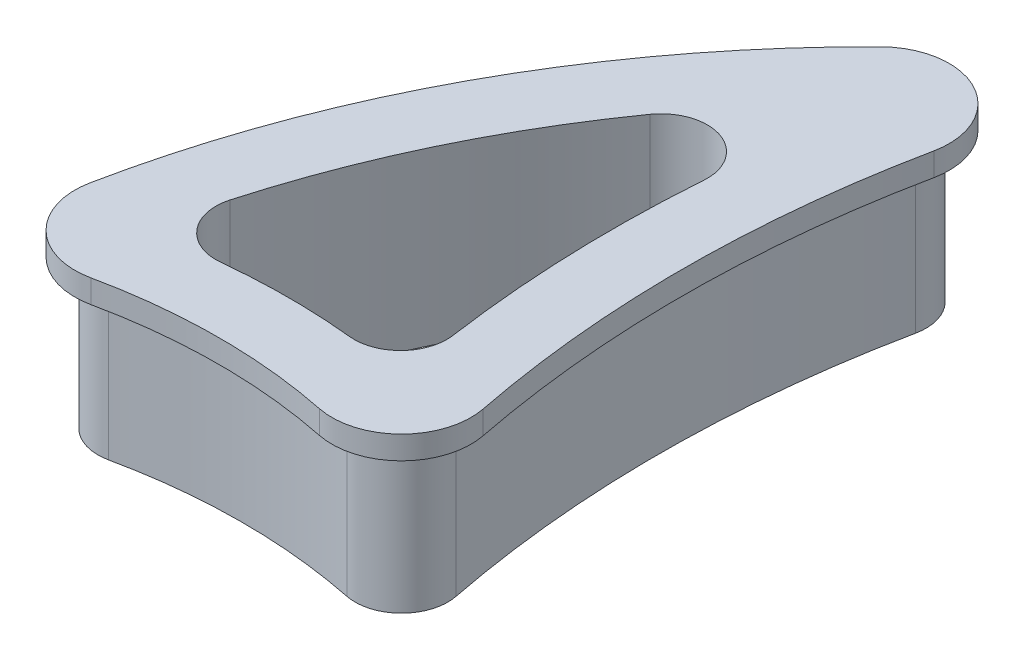
ISO-10303-21;
HEADER;
FILE_DESCRIPTION(('STEP AP214'),'2;1');
FILE_NAME('part.step','',(''),(''),'','','');
FILE_SCHEMA(('AUTOMOTIVE_DESIGN { 1 0 10303 214 1 1 1 1 }'));
ENDSEC;
DATA;
#1=APPLICATION_CONTEXT('core data for automotive mechanical design processes');
#2=APPLICATION_PROTOCOL_DEFINITION('international standard','automotive_design',2000,#1);
#3=PRODUCT_CONTEXT('',#1,'mechanical');
#4=PRODUCT('Part','Part','',(#3));
#5=PRODUCT_RELATED_PRODUCT_CATEGORY('part','',(#4));
#6=PRODUCT_DEFINITION_FORMATION('','',#4);
#7=PRODUCT_DEFINITION_CONTEXT('part definition',#1,'design');
#8=PRODUCT_DEFINITION('design','',#6,#7);
#9=PRODUCT_DEFINITION_SHAPE('','',#8);
#10=(LENGTH_UNIT() NAMED_UNIT(*) SI_UNIT(.MILLI.,.METRE.));
#11=(NAMED_UNIT(*) PLANE_ANGLE_UNIT() SI_UNIT($,.RADIAN.));
#12=(NAMED_UNIT(*) SI_UNIT($,.STERADIAN.) SOLID_ANGLE_UNIT());
#13=UNCERTAINTY_MEASURE_WITH_UNIT(LENGTH_MEASURE(1.E-05),#10,'distance_accuracy_value','');
#14=(GEOMETRIC_REPRESENTATION_CONTEXT(3) GLOBAL_UNCERTAINTY_ASSIGNED_CONTEXT((#13)) GLOBAL_UNIT_ASSIGNED_CONTEXT((#10,
#11,#12)) REPRESENTATION_CONTEXT('',''));
#15=CARTESIAN_POINT('',(0.,0.,0.));
#16=DIRECTION('',(0.,0.,1.));
#17=DIRECTION('',(1.,0.,0.));
#18=AXIS2_PLACEMENT_3D('',#15,#16,#17);
#19=CARTESIAN_POINT('',(-7.36020796228612,0.,29.1675967172615));
#20=DIRECTION('',(0.,1.,0.));
#21=DIRECTION('',(0.,0.,1.));
#22=AXIS2_PLACEMENT_3D('',#19,#20,#21);
#23=PLANE('',#22);
#24=CARTESIAN_POINT('',(-10.1796640957932,0.,15.9652989206191));
#25=DIRECTION('',(0.,1.,0.));
#26=DIRECTION('',(0.,0.,1.));
#27=AXIS2_PLACEMENT_3D('',#24,#25,#26);
#28=CIRCLE('',#27,2.);
#29=CARTESIAN_POINT('',(-12.1404156393956,0.,15.5710231487782));
#30=VERTEX_POINT('',#29);
#31=CARTESIAN_POINT('',(-9.76196689082921,0.,17.921194890492));
#32=VERTEX_POINT('',#31);
#33=EDGE_CURVE('E150',#30,#32,#28,.T.);
#34=ORIENTED_EDGE('',*,*,#33,.F.);
#35=CARTESIAN_POINT('',(29.0353667762552,0.,23.8508143574366));
#36=DIRECTION('',(0.,1.,0.));
#37=DIRECTION('',(0.,0.,1.));
#38=AXIS2_PLACEMENT_3D('',#35,#36,#37);
#39=CIRCLE('',#38,42.);
#40=CARTESIAN_POINT('',(-0.452755983980344,0.,-6.05655289675813));
#41=VERTEX_POINT('',#40);
#42=EDGE_CURVE('E94',#41,#30,#39,.T.);
#43=ORIENTED_EDGE('',*,*,#42,.F.);
#44=CARTESIAN_POINT('',(0.951440337935632,0.,-4.63239255132028));
#45=DIRECTION('',(0.,1.,0.));
#46=DIRECTION('',(0.,0.,-1.));
#47=AXIS2_PLACEMENT_3D('',#44,#45,#46);
#48=CIRCLE('',#47,2.);
#49=CARTESIAN_POINT('',(2.91037615764035,0.,-4.22919228559886));
#50=VERTEX_POINT('',#49);
#51=EDGE_CURVE('E163',#50,#41,#48,.T.);
#52=ORIENTED_EDGE('',*,*,#51,.F.);
#53=CARTESIAN_POINT('',(51.8837716502582,0.,5.85081435743656));
#54=DIRECTION('',(0.,-1.,0.));
#55=DIRECTION('',(0.,0.,-1.));
#56=AXIS2_PLACEMENT_3D('',#53,#54,#55);
#57=CIRCLE('',#56,50.);
#58=CARTESIAN_POINT('',(2.82956510408878,0.,15.5299062634858));
#59=VERTEX_POINT('',#58);
#60=EDGE_CURVE('E160',#59,#50,#57,.T.);
#61=ORIENTED_EDGE('',*,*,#60,.F.);
#62=CARTESIAN_POINT('',(0.867396842242008,0.,15.9170699397278));
#63=DIRECTION('',(0.,1.,0.));
#64=DIRECTION('',(0.,0.,1.));
#65=AXIS2_PLACEMENT_3D('',#62,#63,#64);
#66=CIRCLE('',#65,2.);
#67=CARTESIAN_POINT('',(0.46679323698119,0.,17.8765384267038));
#68=VERTEX_POINT('',#67);
#69=EDGE_CURVE('E118',#68,#59,#66,.T.);
#70=ORIENTED_EDGE('',*,*,#69,.F.);
#71=CARTESIAN_POINT('',(-4.54075182877902,0.,42.3698945139039));
#72=DIRECTION('',(0.,-1.,0.));
#73=DIRECTION('',(0.,0.,-1.));
#74=AXIS2_PLACEMENT_3D('',#71,#72,#73);
#75=CIRCLE('',#74,25.);
#76=EDGE_CURVE('E154',#32,#68,#75,.T.);
#77=ORIENTED_EDGE('',*,*,#76,.F.);
#78=EDGE_LOOP('',(#34,#43,#52,#61,#70,#77));
#79=FACE_BOUND('',#78,.T.);
#80=CARTESIAN_POINT('',(-7.5347674700161,0.,13.5248625267483));
#81=DIRECTION('',(0.,1.,0.));
#82=DIRECTION('',(0.,0.,1.));
#83=AXIS2_PLACEMENT_3D('',#80,#81,#82);
#84=CIRCLE('',#83,2.);
#85=CARTESIAN_POINT('',(-9.45951137771458,0.,12.9813913777647));
#86=VERTEX_POINT('',#85);
#87=CARTESIAN_POINT('',(-7.3282836326894,0.,15.5141750775866));
#88=VERTEX_POINT('',#87);
#89=EDGE_CURVE('E58',#86,#88,#84,.T.);
#90=ORIENTED_EDGE('',*,*,#89,.T.);
#91=CARTESIAN_POINT('',(-4.54075182877902,0.,42.3698945139039));
#92=DIRECTION('',(0.,-1.,0.));
#93=DIRECTION('',(0.,0.,-1.));
#94=AXIS2_PLACEMENT_3D('',#91,#92,#93);
#95=CIRCLE('',#94,27.);
#96=CARTESIAN_POINT('',(-1.77346678919542,0.,15.5120812464449));
#97=VERTEX_POINT('',#96);
#98=EDGE_CURVE('E225',#88,#97,#95,.T.);
#99=ORIENTED_EDGE('',*,*,#98,.T.);
#100=CARTESIAN_POINT('',(-1.56848271218923,0.,13.5226135970035));
#101=DIRECTION('',(0.,1.,0.));
#102=DIRECTION('',(0.,0.,1.));
#103=AXIS2_PLACEMENT_3D('',#100,#101,#102);
#104=CIRCLE('',#103,2.);
#105=CARTESIAN_POINT('',(0.411230412345864,0.,13.2384728844269));
#106=VERTEX_POINT('',#105);
#107=EDGE_CURVE('E221',#97,#106,#104,.T.);
#108=ORIENTED_EDGE('',*,*,#107,.T.);
#109=CARTESIAN_POINT('',(51.8837716502582,0.,5.85081435743656));
#110=DIRECTION('',(0.,-1.,0.));
#111=DIRECTION('',(0.,0.,-1.));
#112=AXIS2_PLACEMENT_3D('',#109,#110,#111);
#113=CIRCLE('',#112,52.);
#114=CARTESIAN_POINT('',(0.024455921151423,0.,2.02833190373986));
#115=VERTEX_POINT('',#114);
#116=EDGE_CURVE('E217',#106,#115,#113,.T.);
#117=ORIENTED_EDGE('',*,*,#116,.T.);
#118=CARTESIAN_POINT('',(-1.97013314535268,0.,1.88131334782845));
#119=DIRECTION('',(0.,1.,0.));
#120=DIRECTION('',(0.,0.,1.));
#121=AXIS2_PLACEMENT_3D('',#118,#119,#120);
#122=CIRCLE('',#121,2.);
#123=CARTESIAN_POINT('',(-3.60200156227942,0.,0.725023821006962));
#124=VERTEX_POINT('',#123);
#125=EDGE_CURVE('E213',#115,#124,#122,.T.);
#126=ORIENTED_EDGE('',*,*,#125,.T.);
#127=CARTESIAN_POINT('',(29.0353667762552,0.,23.8508143574366));
#128=DIRECTION('',(0.,1.,0.));
#129=DIRECTION('',(0.,0.,1.));
#130=AXIS2_PLACEMENT_3D('',#127,#128,#129);
#131=CIRCLE('',#130,40.);
#132=EDGE_CURVE('E209',#124,#86,#131,.T.);
#133=ORIENTED_EDGE('',*,*,#132,.T.);
#134=EDGE_LOOP('',(#90,#99,#108,#117,#126,#133));
#135=FACE_BOUND('',#134,.T.);
#136=ADVANCED_FACE('F42',(#79,#135),#23,.F.);
#137=CARTESIAN_POINT('',(-10.1796640957932,6.4,15.9652989206191));
#138=DIRECTION('',(0.,-1.,0.));
#139=DIRECTION('',(0.,0.,-1.));
#140=AXIS2_PLACEMENT_3D('',#137,#138,#139);
#141=CYLINDRICAL_SURFACE('',#140,2.);
#142=ORIENTED_EDGE('',*,*,#33,.T.);
#143=DIRECTION('',(0.,-1.,0.));
#144=VECTOR('',#143,1.);
#145=CARTESIAN_POINT('',(-9.76196689082921,6.4,17.921194890492));
#146=LINE('',#145,#144);
#147=CARTESIAN_POINT('',(-9.76196689082921,6.4,17.921194890492));
#148=VERTEX_POINT('',#147);
#149=EDGE_CURVE('E11',#148,#32,#146,.T.);
#150=ORIENTED_EDGE('',*,*,#149,.F.);
#151=CARTESIAN_POINT('',(-10.1796640957932,6.4,15.9652989206191));
#152=DIRECTION('',(0.,1.,0.));
#153=DIRECTION('',(0.,0.,1.));
#154=AXIS2_PLACEMENT_3D('',#151,#152,#153);
#155=CIRCLE('',#154,2.);
#156=CARTESIAN_POINT('',(-12.1404156393956,6.4,15.5710231487782));
#157=VERTEX_POINT('',#156);
#158=EDGE_CURVE('E140',#157,#148,#155,.T.);
#159=ORIENTED_EDGE('',*,*,#158,.F.);
#160=DIRECTION('',(0.,-1.,0.));
#161=VECTOR('',#160,1.);
#162=CARTESIAN_POINT('',(-12.1404156393956,6.4,15.5710231487782));
#163=LINE('',#162,#161);
#164=EDGE_CURVE('E149',#157,#30,#163,.T.);
#165=ORIENTED_EDGE('',*,*,#164,.T.);
#166=EDGE_LOOP('',(#142,#150,#159,#165));
#167=FACE_BOUND('',#166,.T.);
#168=ADVANCED_FACE('F44',(#167),#141,.T.);
#169=CARTESIAN_POINT('',(-4.54075182877902,6.4,42.3698945139039));
#170=DIRECTION('',(0.,-1.,0.));
#171=DIRECTION('',(0.,0.,-1.));
#172=AXIS2_PLACEMENT_3D('',#169,#170,#171);
#173=CYLINDRICAL_SURFACE('',#172,25.);
#174=ORIENTED_EDGE('',*,*,#76,.T.);
#175=DIRECTION('',(0.,-1.,0.));
#176=VECTOR('',#175,1.);
#177=CARTESIAN_POINT('',(0.46679323698119,6.4,17.8765384267038));
#178=LINE('',#177,#176);
#179=CARTESIAN_POINT('',(0.46679323698119,6.4,17.8765384267038));
#180=VERTEX_POINT('',#179);
#181=EDGE_CURVE('E51',#180,#68,#178,.T.);
#182=ORIENTED_EDGE('',*,*,#181,.F.);
#183=CARTESIAN_POINT('',(-4.54075182877902,6.4,42.3698945139039));
#184=DIRECTION('',(0.,-1.,0.));
#185=DIRECTION('',(0.,0.,-1.));
#186=AXIS2_PLACEMENT_3D('',#183,#184,#185);
#187=CIRCLE('',#186,25.);
#188=EDGE_CURVE('E102',#148,#180,#187,.T.);
#189=ORIENTED_EDGE('',*,*,#188,.F.);
#190=ORIENTED_EDGE('',*,*,#149,.T.);
#191=EDGE_LOOP('',(#174,#182,#189,#190));
#192=FACE_BOUND('',#191,.T.);
#193=ADVANCED_FACE('F411',(#192),#173,.F.);
#194=CARTESIAN_POINT('',(0.867396842242008,6.4,15.9170699397278));
#195=DIRECTION('',(0.,-1.,0.));
#196=DIRECTION('',(0.,0.,-1.));
#197=AXIS2_PLACEMENT_3D('',#194,#195,#196);
#198=CYLINDRICAL_SURFACE('',#197,2.);
#199=ORIENTED_EDGE('',*,*,#69,.T.);
#200=DIRECTION('',(0.,-1.,0.));
#201=VECTOR('',#200,1.);
#202=CARTESIAN_POINT('',(2.82956510408878,6.4,15.5299062634858));
#203=LINE('',#202,#201);
#204=CARTESIAN_POINT('',(2.82956510408878,6.4,15.5299062634858));
#205=VERTEX_POINT('',#204);
#206=EDGE_CURVE('E111',#205,#59,#203,.T.);
#207=ORIENTED_EDGE('',*,*,#206,.F.);
#208=CARTESIAN_POINT('',(0.867396842242008,6.4,15.9170699397278));
#209=DIRECTION('',(0.,1.,0.));
#210=DIRECTION('',(0.,0.,1.));
#211=AXIS2_PLACEMENT_3D('',#208,#209,#210);
#212=CIRCLE('',#211,2.);
#213=EDGE_CURVE('E116',#180,#205,#212,.T.);
#214=ORIENTED_EDGE('',*,*,#213,.F.);
#215=ORIENTED_EDGE('',*,*,#181,.T.);
#216=EDGE_LOOP('',(#199,#207,#214,#215));
#217=FACE_BOUND('',#216,.T.);
#218=ADVANCED_FACE('F113',(#217),#198,.T.);
#219=CARTESIAN_POINT('',(51.8837716502582,6.4,5.85081435743656));
#220=DIRECTION('',(0.,-1.,0.));
#221=DIRECTION('',(0.,0.,-1.));
#222=AXIS2_PLACEMENT_3D('',#219,#220,#221);
#223=CYLINDRICAL_SURFACE('',#222,50.);
#224=ORIENTED_EDGE('',*,*,#60,.T.);
#225=DIRECTION('',(0.,-1.,0.));
#226=VECTOR('',#225,1.);
#227=CARTESIAN_POINT('',(2.91037615764035,6.4,-4.22919228559886));
#228=LINE('',#227,#226);
#229=CARTESIAN_POINT('',(2.91037615764035,6.4,-4.22919228559886));
#230=VERTEX_POINT('',#229);
#231=EDGE_CURVE('E122',#230,#50,#228,.T.);
#232=ORIENTED_EDGE('',*,*,#231,.F.);
#233=CARTESIAN_POINT('',(51.8837716502582,6.4,5.85081435743656));
#234=DIRECTION('',(0.,-1.,0.));
#235=DIRECTION('',(0.,0.,-1.));
#236=AXIS2_PLACEMENT_3D('',#233,#234,#235);
#237=CIRCLE('',#236,50.);
#238=EDGE_CURVE('E125',#205,#230,#237,.T.);
#239=ORIENTED_EDGE('',*,*,#238,.F.);
#240=ORIENTED_EDGE('',*,*,#206,.T.);
#241=EDGE_LOOP('',(#224,#232,#239,#240));
#242=FACE_BOUND('',#241,.T.);
#243=ADVANCED_FACE('F126',(#242),#223,.F.);
#244=CARTESIAN_POINT('',(0.951440337935632,6.4,-4.63239255132028));
#245=DIRECTION('',(0.,-1.,0.));
#246=DIRECTION('',(0.,0.,-1.));
#247=AXIS2_PLACEMENT_3D('',#244,#245,#246);
#248=CYLINDRICAL_SURFACE('',#247,2.);
#249=ORIENTED_EDGE('',*,*,#51,.T.);
#250=DIRECTION('',(0.,-1.,0.));
#251=VECTOR('',#250,1.);
#252=CARTESIAN_POINT('',(-0.452755983980344,6.4,-6.05655289675813));
#253=LINE('',#252,#251);
#254=CARTESIAN_POINT('',(-0.452755983980344,6.4,-6.05655289675813));
#255=VERTEX_POINT('',#254);
#256=EDGE_CURVE('E67',#255,#41,#253,.T.);
#257=ORIENTED_EDGE('',*,*,#256,.F.);
#258=CARTESIAN_POINT('',(0.951440337935632,6.4,-4.63239255132028));
#259=DIRECTION('',(0.,1.,0.));
#260=DIRECTION('',(0.,0.,-1.));
#261=AXIS2_PLACEMENT_3D('',#258,#259,#260);
#262=CIRCLE('',#261,2.);
#263=EDGE_CURVE('E131',#230,#255,#262,.T.);
#264=ORIENTED_EDGE('',*,*,#263,.F.);
#265=ORIENTED_EDGE('',*,*,#231,.T.);
#266=EDGE_LOOP('',(#249,#257,#264,#265));
#267=FACE_BOUND('',#266,.T.);
#268=ADVANCED_FACE('F178',(#267),#248,.T.);
#269=CARTESIAN_POINT('',(29.0353667762552,6.4,23.8508143574366));
#270=DIRECTION('',(0.,-1.,0.));
#271=DIRECTION('',(0.,0.,-1.));
#272=AXIS2_PLACEMENT_3D('',#269,#270,#271);
#273=CYLINDRICAL_SURFACE('',#272,42.);
#274=ORIENTED_EDGE('',*,*,#42,.T.);
#275=ORIENTED_EDGE('',*,*,#164,.F.);
#276=CARTESIAN_POINT('',(29.0353667762552,6.4,23.8508143574366));
#277=DIRECTION('',(0.,1.,0.));
#278=DIRECTION('',(0.,0.,1.));
#279=AXIS2_PLACEMENT_3D('',#276,#277,#278);
#280=CIRCLE('',#279,42.);
#281=EDGE_CURVE('E146',#255,#157,#280,.T.);
#282=ORIENTED_EDGE('',*,*,#281,.F.);
#283=ORIENTED_EDGE('',*,*,#256,.T.);
#284=EDGE_LOOP('',(#274,#275,#282,#283));
#285=FACE_BOUND('',#284,.T.);
#286=ADVANCED_FACE('F184',(#285),#273,.T.);
#287=CARTESIAN_POINT('',(-7.5347674700161,6.4,13.5248625267483));
#288=DIRECTION('',(0.,-1.,0.));
#289=DIRECTION('',(0.,0.,-1.));
#290=AXIS2_PLACEMENT_3D('',#287,#288,#289);
#291=CYLINDRICAL_SURFACE('',#290,2.);
#292=ORIENTED_EDGE('',*,*,#89,.F.);
#293=DIRECTION('',(0.,-1.,0.));
#294=VECTOR('',#293,1.);
#295=CARTESIAN_POINT('',(-9.45951137771458,6.4,12.9813913777647));
#296=LINE('',#295,#294);
#297=CARTESIAN_POINT('',(-9.45951137771459,7.4,12.9813913777647));
#298=VERTEX_POINT('',#297);
#299=EDGE_CURVE('E206',#298,#86,#296,.T.);
#300=ORIENTED_EDGE('',*,*,#299,.F.);
#301=CARTESIAN_POINT('',(-7.5347674700161,7.4,13.5248625267483));
#302=DIRECTION('',(0.,1.,0.));
#303=DIRECTION('',(0.,0.,1.));
#304=AXIS2_PLACEMENT_3D('',#301,#302,#303);
#305=CIRCLE('',#304,2.);
#306=CARTESIAN_POINT('',(-7.32828363268939,7.4,15.5141750775866));
#307=VERTEX_POINT('',#306);
#308=EDGE_CURVE('E315',#298,#307,#305,.T.);
#309=ORIENTED_EDGE('',*,*,#308,.T.);
#310=DIRECTION('',(0.,-1.,0.));
#311=VECTOR('',#310,1.);
#312=CARTESIAN_POINT('',(-7.3282836326894,6.4,15.5141750775866));
#313=LINE('',#312,#311);
#314=EDGE_CURVE('E155',#307,#88,#313,.T.);
#315=ORIENTED_EDGE('',*,*,#314,.T.);
#316=EDGE_LOOP('',(#292,#300,#309,#315));
#317=FACE_BOUND('',#316,.T.);
#318=ADVANCED_FACE('F397',(#317),#291,.F.);
#319=CARTESIAN_POINT('',(-4.54075182877902,6.4,42.3698945139039));
#320=DIRECTION('',(0.,-1.,0.));
#321=DIRECTION('',(0.,0.,-1.));
#322=AXIS2_PLACEMENT_3D('',#319,#320,#321);
#323=CYLINDRICAL_SURFACE('',#322,27.);
#324=ORIENTED_EDGE('',*,*,#98,.F.);
#325=ORIENTED_EDGE('',*,*,#314,.F.);
#326=CARTESIAN_POINT('',(-4.54075182877902,7.4,42.3698945139039));
#327=DIRECTION('',(0.,-1.,0.));
#328=DIRECTION('',(0.,0.,1.));
#329=AXIS2_PLACEMENT_3D('',#326,#327,#328);
#330=CIRCLE('',#329,27.);
#331=CARTESIAN_POINT('',(-1.77346678919542,7.4,15.5120812464449));
#332=VERTEX_POINT('',#331);
#333=EDGE_CURVE('E311',#307,#332,#330,.T.);
#334=ORIENTED_EDGE('',*,*,#333,.T.);
#335=DIRECTION('',(0.,-1.,0.));
#336=VECTOR('',#335,1.);
#337=CARTESIAN_POINT('',(-1.77346678919542,6.4,15.5120812464449));
#338=LINE('',#337,#336);
#339=EDGE_CURVE('E190',#332,#97,#338,.T.);
#340=ORIENTED_EDGE('',*,*,#339,.T.);
#341=EDGE_LOOP('',(#324,#325,#334,#340));
#342=FACE_BOUND('',#341,.T.);
#343=ADVANCED_FACE('F396',(#342),#323,.T.);
#344=CARTESIAN_POINT('',(-1.56848271218923,6.4,13.5226135970035));
#345=DIRECTION('',(0.,-1.,0.));
#346=DIRECTION('',(0.,0.,-1.));
#347=AXIS2_PLACEMENT_3D('',#344,#345,#346);
#348=CYLINDRICAL_SURFACE('',#347,2.);
#349=ORIENTED_EDGE('',*,*,#107,.F.);
#350=ORIENTED_EDGE('',*,*,#339,.F.);
#351=CARTESIAN_POINT('',(-1.56848271218923,7.4,13.5226135970035));
#352=DIRECTION('',(0.,1.,0.));
#353=DIRECTION('',(0.,0.,1.));
#354=AXIS2_PLACEMENT_3D('',#351,#352,#353);
#355=CIRCLE('',#354,1.99999999999999);
#356=CARTESIAN_POINT('',(0.411230412345857,7.4,13.2384728844269));
#357=VERTEX_POINT('',#356);
#358=EDGE_CURVE('E307',#332,#357,#355,.T.);
#359=ORIENTED_EDGE('',*,*,#358,.T.);
#360=DIRECTION('',(0.,-1.,0.));
#361=VECTOR('',#360,1.);
#362=CARTESIAN_POINT('',(0.411230412345864,6.4,13.2384728844269));
#363=LINE('',#362,#361);
#364=EDGE_CURVE('E194',#357,#106,#363,.T.);
#365=ORIENTED_EDGE('',*,*,#364,.T.);
#366=EDGE_LOOP('',(#349,#350,#359,#365));
#367=FACE_BOUND('',#366,.T.);
#368=ADVANCED_FACE('F393',(#367),#348,.F.);
#369=CARTESIAN_POINT('',(51.8837716502582,6.4,5.85081435743656));
#370=DIRECTION('',(0.,-1.,0.));
#371=DIRECTION('',(0.,0.,-1.));
#372=AXIS2_PLACEMENT_3D('',#369,#370,#371);
#373=CYLINDRICAL_SURFACE('',#372,52.);
#374=ORIENTED_EDGE('',*,*,#116,.F.);
#375=ORIENTED_EDGE('',*,*,#364,.F.);
#376=CARTESIAN_POINT('',(51.8837716502582,7.4,5.85081435743656));
#377=DIRECTION('',(0.,-1.,0.));
#378=DIRECTION('',(0.,0.,1.));
#379=AXIS2_PLACEMENT_3D('',#376,#377,#378);
#380=CIRCLE('',#379,52.);
#381=CARTESIAN_POINT('',(0.0244559211514256,7.4,2.02833190373986));
#382=VERTEX_POINT('',#381);
#383=EDGE_CURVE('E281',#357,#382,#380,.T.);
#384=ORIENTED_EDGE('',*,*,#383,.T.);
#385=DIRECTION('',(0.,-1.,0.));
#386=VECTOR('',#385,1.);
#387=CARTESIAN_POINT('',(0.024455921151423,6.4,2.02833190373986));
#388=LINE('',#387,#386);
#389=EDGE_CURVE('E198',#382,#115,#388,.T.);
#390=ORIENTED_EDGE('',*,*,#389,.T.);
#391=EDGE_LOOP('',(#374,#375,#384,#390));
#392=FACE_BOUND('',#391,.T.);
#393=ADVANCED_FACE('F390',(#392),#373,.T.);
#394=CARTESIAN_POINT('',(-1.97013314535268,6.4,1.88131334782845));
#395=DIRECTION('',(0.,-1.,0.));
#396=DIRECTION('',(0.,0.,-1.));
#397=AXIS2_PLACEMENT_3D('',#394,#395,#396);
#398=CYLINDRICAL_SURFACE('',#397,2.);
#399=ORIENTED_EDGE('',*,*,#125,.F.);
#400=ORIENTED_EDGE('',*,*,#389,.F.);
#401=CARTESIAN_POINT('',(-1.97013314535268,7.4,1.88131334782845));
#402=DIRECTION('',(0.,1.,0.));
#403=DIRECTION('',(0.,0.,1.));
#404=AXIS2_PLACEMENT_3D('',#401,#402,#403);
#405=CIRCLE('',#404,2.);
#406=CARTESIAN_POINT('',(-3.60200156227942,7.4,0.725023821006962));
#407=VERTEX_POINT('',#406);
#408=EDGE_CURVE('E323',#382,#407,#405,.T.);
#409=ORIENTED_EDGE('',*,*,#408,.T.);
#410=DIRECTION('',(0.,-1.,0.));
#411=VECTOR('',#410,1.);
#412=CARTESIAN_POINT('',(-3.60200156227942,6.4,0.725023821006962));
#413=LINE('',#412,#411);
#414=EDGE_CURVE('E202',#407,#124,#413,.T.);
#415=ORIENTED_EDGE('',*,*,#414,.T.);
#416=EDGE_LOOP('',(#399,#400,#409,#415));
#417=FACE_BOUND('',#416,.T.);
#418=ADVANCED_FACE('F332',(#417),#398,.F.);
#419=CARTESIAN_POINT('',(29.0353667762552,6.4,23.8508143574366));
#420=DIRECTION('',(0.,-1.,0.));
#421=DIRECTION('',(0.,0.,-1.));
#422=AXIS2_PLACEMENT_3D('',#419,#420,#421);
#423=CYLINDRICAL_SURFACE('',#422,40.);
#424=ORIENTED_EDGE('',*,*,#132,.F.);
#425=ORIENTED_EDGE('',*,*,#414,.F.);
#426=CARTESIAN_POINT('',(29.0353667762552,7.4,23.8508143574366));
#427=DIRECTION('',(0.,1.,0.));
#428=DIRECTION('',(0.,0.,1.));
#429=AXIS2_PLACEMENT_3D('',#426,#427,#428);
#430=CIRCLE('',#429,40.);
#431=EDGE_CURVE('E319',#407,#298,#430,.T.);
#432=ORIENTED_EDGE('',*,*,#431,.T.);
#433=ORIENTED_EDGE('',*,*,#299,.T.);
#434=EDGE_LOOP('',(#424,#425,#432,#433));
#435=FACE_BOUND('',#434,.T.);
#436=ADVANCED_FACE('F344',(#435),#423,.F.);
#437=CARTESIAN_POINT('',(14.9934035570954,7.4,9.60921090305814));
#438=DIRECTION('',(0.,1.,0.));
#439=DIRECTION('',(0.,0.,1.));
#440=AXIS2_PLACEMENT_3D('',#437,#438,#439);
#441=PLANE('',#440);
#442=CARTESIAN_POINT('',(0.951440337935632,7.4,-4.63239255132028));
#443=DIRECTION('',(0.,1.,0.));
#444=DIRECTION('',(0.,0.,1.));
#445=AXIS2_PLACEMENT_3D('',#442,#443,#444);
#446=CIRCLE('',#445,3.00000000000001);
#447=CARTESIAN_POINT('',(3.88984406749272,7.4,-4.02759215273816));
#448=VERTEX_POINT('',#447);
#449=CARTESIAN_POINT('',(-1.15485414493833,7.4,-6.76863306947704));
#450=VERTEX_POINT('',#449);
#451=EDGE_CURVE('E260',#448,#450,#446,.T.);
#452=ORIENTED_EDGE('',*,*,#451,.T.);
#453=CARTESIAN_POINT('',(29.0353667762552,7.4,23.8508143574366));
#454=DIRECTION('',(0.,1.,0.));
#455=DIRECTION('',(0.,0.,1.));
#456=AXIS2_PLACEMENT_3D('',#453,#454,#455);
#457=CIRCLE('',#456,43.);
#458=CARTESIAN_POINT('',(-13.1207914111969,7.4,15.3738852628578));
#459=VERTEX_POINT('',#458);
#460=EDGE_CURVE('E297',#450,#459,#457,.T.);
#461=ORIENTED_EDGE('',*,*,#460,.T.);
#462=CARTESIAN_POINT('',(-10.1796640957932,7.4,15.9652989206191));
#463=DIRECTION('',(0.,1.,0.));
#464=DIRECTION('',(0.,0.,1.));
#465=AXIS2_PLACEMENT_3D('',#462,#463,#464);
#466=CIRCLE('',#465,3.);
#467=CARTESIAN_POINT('',(-9.55311828834719,7.4,18.8991428754285));
#468=VERTEX_POINT('',#467);
#469=EDGE_CURVE('E293',#459,#468,#466,.T.);
#470=ORIENTED_EDGE('',*,*,#469,.T.);
#471=CARTESIAN_POINT('',(-4.54075182877902,7.4,42.3698945139039));
#472=DIRECTION('',(0.,-1.,0.));
#473=DIRECTION('',(0.,0.,1.));
#474=AXIS2_PLACEMENT_3D('',#471,#472,#473);
#475=CIRCLE('',#474,24.);
#476=CARTESIAN_POINT('',(0.266491434350783,7.4,18.8562726701918));
#477=VERTEX_POINT('',#476);
#478=EDGE_CURVE('E289',#468,#477,#475,.T.);
#479=ORIENTED_EDGE('',*,*,#478,.T.);
#480=CARTESIAN_POINT('',(0.867396842242008,7.4,15.9170699397278));
#481=DIRECTION('',(0.,1.,0.));
#482=DIRECTION('',(0.,0.,1.));
#483=AXIS2_PLACEMENT_3D('',#480,#481,#482);
#484=CIRCLE('',#483,3.);
#485=CARTESIAN_POINT('',(3.81064923501215,7.4,15.3363244253648));
#486=VERTEX_POINT('',#485);
#487=EDGE_CURVE('E285',#477,#486,#484,.T.);
#488=ORIENTED_EDGE('',*,*,#487,.T.);
#489=CARTESIAN_POINT('',(51.8837716502582,7.4,5.85081435743656));
#490=DIRECTION('',(0.,-1.,0.));
#491=DIRECTION('',(0.,0.,1.));
#492=AXIS2_PLACEMENT_3D('',#489,#490,#491);
#493=CIRCLE('',#492,49.);
#494=EDGE_CURVE('E255',#486,#448,#493,.T.);
#495=ORIENTED_EDGE('',*,*,#494,.T.);
#496=EDGE_LOOP('',(#452,#461,#470,#479,#488,#495));
#497=FACE_BOUND('',#496,.T.);
#498=ORIENTED_EDGE('',*,*,#431,.F.);
#499=ORIENTED_EDGE('',*,*,#408,.F.);
#500=ORIENTED_EDGE('',*,*,#383,.F.);
#501=ORIENTED_EDGE('',*,*,#358,.F.);
#502=ORIENTED_EDGE('',*,*,#333,.F.);
#503=ORIENTED_EDGE('',*,*,#308,.F.);
#504=EDGE_LOOP('',(#498,#499,#500,#501,#502,#503));
#505=FACE_BOUND('',#504,.T.);
#506=ADVANCED_FACE('F341',(#497,#505),#441,.T.);
#507=CARTESIAN_POINT('',(14.9934035570954,6.4,9.60921090305814));
#508=DIRECTION('',(0.,1.,0.));
#509=DIRECTION('',(0.,0.,1.));
#510=AXIS2_PLACEMENT_3D('',#507,#508,#509);
#511=PLANE('',#510);
#512=ORIENTED_EDGE('',*,*,#281,.T.);
#513=ORIENTED_EDGE('',*,*,#158,.T.);
#514=ORIENTED_EDGE('',*,*,#188,.T.);
#515=ORIENTED_EDGE('',*,*,#213,.T.);
#516=ORIENTED_EDGE('',*,*,#238,.T.);
#517=ORIENTED_EDGE('',*,*,#263,.T.);
#518=EDGE_LOOP('',(#512,#513,#514,#515,#516,#517));
#519=FACE_BOUND('',#518,.T.);
#520=CARTESIAN_POINT('',(0.951440337935632,6.4,-4.63239255132028));
#521=DIRECTION('',(0.,1.,0.));
#522=DIRECTION('',(0.,0.,1.));
#523=AXIS2_PLACEMENT_3D('',#520,#521,#522);
#524=CIRCLE('',#523,3.00000000000001);
#525=CARTESIAN_POINT('',(3.88984406749272,6.4,-4.02759215273816));
#526=VERTEX_POINT('',#525);
#527=CARTESIAN_POINT('',(-1.15485414493833,6.4,-6.76863306947704));
#528=VERTEX_POINT('',#527);
#529=EDGE_CURVE('E277',#526,#528,#524,.T.);
#530=ORIENTED_EDGE('',*,*,#529,.F.);
#531=CARTESIAN_POINT('',(51.8837716502582,6.4,5.85081435743656));
#532=DIRECTION('',(0.,-1.,0.));
#533=DIRECTION('',(0.,0.,1.));
#534=AXIS2_PLACEMENT_3D('',#531,#532,#533);
#535=CIRCLE('',#534,49.);
#536=CARTESIAN_POINT('',(3.81064923501215,6.4,15.3363244253648));
#537=VERTEX_POINT('',#536);
#538=EDGE_CURVE('E256',#537,#526,#535,.T.);
#539=ORIENTED_EDGE('',*,*,#538,.F.);
#540=CARTESIAN_POINT('',(0.867396842242008,6.4,15.9170699397278));
#541=DIRECTION('',(0.,1.,0.));
#542=DIRECTION('',(0.,0.,1.));
#543=AXIS2_PLACEMENT_3D('',#540,#541,#542);
#544=CIRCLE('',#543,3.);
#545=CARTESIAN_POINT('',(0.266491434350783,6.4,18.8562726701918));
#546=VERTEX_POINT('',#545);
#547=EDGE_CURVE('E261',#546,#537,#544,.T.);
#548=ORIENTED_EDGE('',*,*,#547,.F.);
#549=CARTESIAN_POINT('',(-4.54075182877902,6.4,42.3698945139039));
#550=DIRECTION('',(0.,-1.,0.));
#551=DIRECTION('',(0.,0.,1.));
#552=AXIS2_PLACEMENT_3D('',#549,#550,#551);
#553=CIRCLE('',#552,24.);
#554=CARTESIAN_POINT('',(-9.55311828834719,6.4,18.8991428754285));
#555=VERTEX_POINT('',#554);
#556=EDGE_CURVE('E265',#555,#546,#553,.T.);
#557=ORIENTED_EDGE('',*,*,#556,.F.);
#558=CARTESIAN_POINT('',(-10.1796640957932,6.4,15.9652989206191));
#559=DIRECTION('',(0.,1.,0.));
#560=DIRECTION('',(0.,0.,1.));
#561=AXIS2_PLACEMENT_3D('',#558,#559,#560);
#562=CIRCLE('',#561,3.);
#563=CARTESIAN_POINT('',(-13.1207914111969,6.4,15.3738852628578));
#564=VERTEX_POINT('',#563);
#565=EDGE_CURVE('E269',#564,#555,#562,.T.);
#566=ORIENTED_EDGE('',*,*,#565,.F.);
#567=CARTESIAN_POINT('',(29.0353667762552,6.4,23.8508143574366));
#568=DIRECTION('',(0.,1.,0.));
#569=DIRECTION('',(0.,0.,1.));
#570=AXIS2_PLACEMENT_3D('',#567,#568,#569);
#571=CIRCLE('',#570,43.);
#572=EDGE_CURVE('E273',#528,#564,#571,.T.);
#573=ORIENTED_EDGE('',*,*,#572,.F.);
#574=EDGE_LOOP('',(#530,#539,#548,#557,#566,#573));
#575=FACE_BOUND('',#574,.T.);
#576=ADVANCED_FACE('F134',(#519,#575),#511,.F.);
#577=CARTESIAN_POINT('',(0.951440337935632,7.4,-4.63239255132028));
#578=DIRECTION('',(0.,-1.,0.));
#579=DIRECTION('',(0.,0.,-1.));
#580=AXIS2_PLACEMENT_3D('',#577,#578,#579);
#581=CYLINDRICAL_SURFACE('',#580,3.00000000000001);
#582=ORIENTED_EDGE('',*,*,#529,.T.);
#583=DIRECTION('',(0.,-1.,0.));
#584=VECTOR('',#583,1.);
#585=CARTESIAN_POINT('',(-1.15485414493833,7.4,-6.76863306947704));
#586=LINE('',#585,#584);
#587=EDGE_CURVE('E231',#450,#528,#586,.T.);
#588=ORIENTED_EDGE('',*,*,#587,.F.);
#589=ORIENTED_EDGE('',*,*,#451,.F.);
#590=DIRECTION('',(0.,-1.,0.));
#591=VECTOR('',#590,1.);
#592=CARTESIAN_POINT('',(3.88984406749272,7.4,-4.02759215273816));
#593=LINE('',#592,#591);
#594=EDGE_CURVE('E251',#448,#526,#593,.T.);
#595=ORIENTED_EDGE('',*,*,#594,.T.);
#596=EDGE_LOOP('',(#582,#588,#589,#595));
#597=FACE_BOUND('',#596,.T.);
#598=ADVANCED_FACE('F507',(#597),#581,.T.);
#599=CARTESIAN_POINT('',(29.0353667762552,7.4,23.8508143574366));
#600=DIRECTION('',(0.,-1.,0.));
#601=DIRECTION('',(0.,0.,-1.));
#602=AXIS2_PLACEMENT_3D('',#599,#600,#601);
#603=CYLINDRICAL_SURFACE('',#602,43.);
#604=ORIENTED_EDGE('',*,*,#572,.T.);
#605=DIRECTION('',(0.,-1.,0.));
#606=VECTOR('',#605,1.);
#607=CARTESIAN_POINT('',(-13.1207914111969,7.4,15.3738852628578));
#608=LINE('',#607,#606);
#609=EDGE_CURVE('E235',#459,#564,#608,.T.);
#610=ORIENTED_EDGE('',*,*,#609,.F.);
#611=ORIENTED_EDGE('',*,*,#460,.F.);
#612=ORIENTED_EDGE('',*,*,#587,.T.);
#613=EDGE_LOOP('',(#604,#610,#611,#612));
#614=FACE_BOUND('',#613,.T.);
#615=ADVANCED_FACE('F517',(#614),#603,.T.);
#616=CARTESIAN_POINT('',(-10.1796640957932,7.4,15.9652989206191));
#617=DIRECTION('',(0.,-1.,0.));
#618=DIRECTION('',(0.,0.,-1.));
#619=AXIS2_PLACEMENT_3D('',#616,#617,#618);
#620=CYLINDRICAL_SURFACE('',#619,3.);
#621=ORIENTED_EDGE('',*,*,#565,.T.);
#622=DIRECTION('',(0.,-1.,0.));
#623=VECTOR('',#622,1.);
#624=CARTESIAN_POINT('',(-9.55311828834719,7.4,18.8991428754285));
#625=LINE('',#624,#623);
#626=EDGE_CURVE('E239',#468,#555,#625,.T.);
#627=ORIENTED_EDGE('',*,*,#626,.F.);
#628=ORIENTED_EDGE('',*,*,#469,.F.);
#629=ORIENTED_EDGE('',*,*,#609,.T.);
#630=EDGE_LOOP('',(#621,#627,#628,#629));
#631=FACE_BOUND('',#630,.T.);
#632=ADVANCED_FACE('F528',(#631),#620,.T.);
#633=CARTESIAN_POINT('',(-4.54075182877902,7.4,42.3698945139039));
#634=DIRECTION('',(0.,-1.,0.));
#635=DIRECTION('',(0.,0.,-1.));
#636=AXIS2_PLACEMENT_3D('',#633,#634,#635);
#637=CYLINDRICAL_SURFACE('',#636,24.);
#638=ORIENTED_EDGE('',*,*,#556,.T.);
#639=DIRECTION('',(0.,-1.,0.));
#640=VECTOR('',#639,1.);
#641=CARTESIAN_POINT('',(0.266491434350783,7.4,18.8562726701918));
#642=LINE('',#641,#640);
#643=EDGE_CURVE('E243',#477,#546,#642,.T.);
#644=ORIENTED_EDGE('',*,*,#643,.F.);
#645=ORIENTED_EDGE('',*,*,#478,.F.);
#646=ORIENTED_EDGE('',*,*,#626,.T.);
#647=EDGE_LOOP('',(#638,#644,#645,#646));
#648=FACE_BOUND('',#647,.T.);
#649=ADVANCED_FACE('F539',(#648),#637,.F.);
#650=CARTESIAN_POINT('',(0.867396842242008,7.4,15.9170699397278));
#651=DIRECTION('',(0.,-1.,0.));
#652=DIRECTION('',(0.,0.,-1.));
#653=AXIS2_PLACEMENT_3D('',#650,#651,#652);
#654=CYLINDRICAL_SURFACE('',#653,3.);
#655=ORIENTED_EDGE('',*,*,#547,.T.);
#656=DIRECTION('',(0.,-1.,0.));
#657=VECTOR('',#656,1.);
#658=CARTESIAN_POINT('',(3.81064923501215,7.4,15.3363244253648));
#659=LINE('',#658,#657);
#660=EDGE_CURVE('E247',#486,#537,#659,.T.);
#661=ORIENTED_EDGE('',*,*,#660,.F.);
#662=ORIENTED_EDGE('',*,*,#487,.F.);
#663=ORIENTED_EDGE('',*,*,#643,.T.);
#664=EDGE_LOOP('',(#655,#661,#662,#663));
#665=FACE_BOUND('',#664,.T.);
#666=ADVANCED_FACE('F550',(#665),#654,.T.);
#667=CARTESIAN_POINT('',(51.8837716502582,7.4,5.85081435743656));
#668=DIRECTION('',(0.,-1.,0.));
#669=DIRECTION('',(0.,0.,-1.));
#670=AXIS2_PLACEMENT_3D('',#667,#668,#669);
#671=CYLINDRICAL_SURFACE('',#670,49.);
#672=ORIENTED_EDGE('',*,*,#538,.T.);
#673=ORIENTED_EDGE('',*,*,#594,.F.);
#674=ORIENTED_EDGE('',*,*,#494,.F.);
#675=ORIENTED_EDGE('',*,*,#660,.T.);
#676=EDGE_LOOP('',(#672,#673,#674,#675));
#677=FACE_BOUND('',#676,.T.);
#678=ADVANCED_FACE('F561',(#677),#671,.F.);
#679=CLOSED_SHELL('',(#136,#168,#193,#218,#243,#268,#286,#318,#343,#368,#393,#418,#436,#506,
#576,#598,#615,#632,#649,#666,#678));
#680=MANIFOLD_SOLID_BREP('B2',#679);
#681=ADVANCED_BREP_SHAPE_REPRESENTATION('',(#18,#680),#14);
#682=SHAPE_DEFINITION_REPRESENTATION(#9,#681);
ENDSEC;
END-ISO-10303-21;
